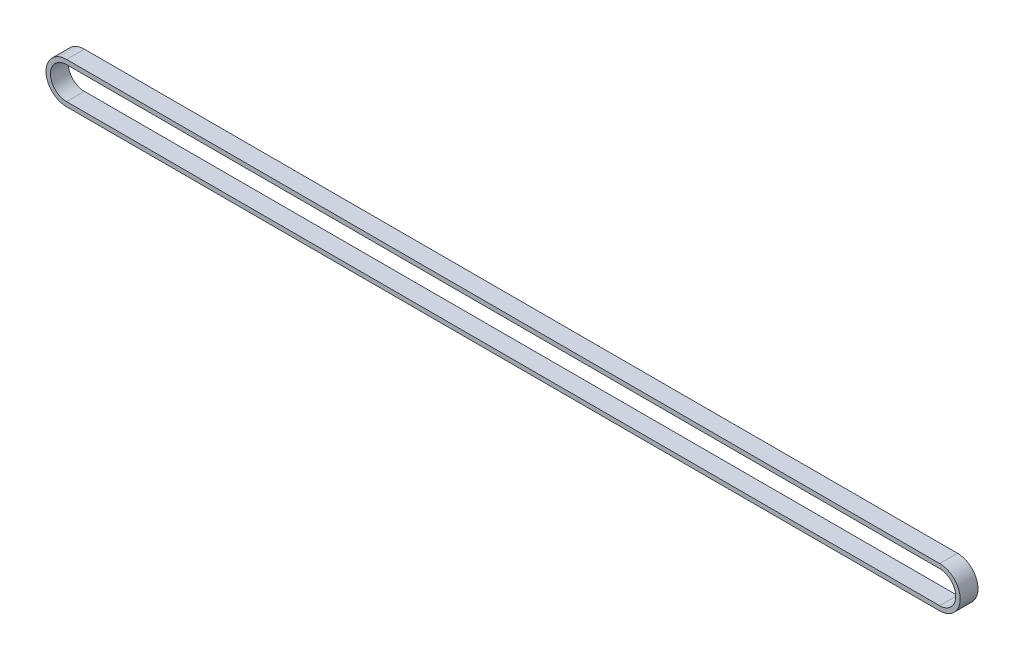
ISO-10303-21;
HEADER;
FILE_DESCRIPTION(('STEP AP214'),'2;1');
FILE_NAME('part.step','',(''),(''),'','','');
FILE_SCHEMA(('AUTOMOTIVE_DESIGN { 1 0 10303 214 1 1 1 1 }'));
ENDSEC;
DATA;
#1=APPLICATION_CONTEXT('core data for automotive mechanical design processes');
#2=APPLICATION_PROTOCOL_DEFINITION('international standard','automotive_design',2000,#1);
#3=PRODUCT_CONTEXT('',#1,'mechanical');
#4=PRODUCT('Part','Part','',(#3));
#5=PRODUCT_RELATED_PRODUCT_CATEGORY('part','',(#4));
#6=PRODUCT_DEFINITION_FORMATION('','',#4);
#7=PRODUCT_DEFINITION_CONTEXT('part definition',#1,'design');
#8=PRODUCT_DEFINITION('design','',#6,#7);
#9=PRODUCT_DEFINITION_SHAPE('','',#8);
#10=(LENGTH_UNIT() NAMED_UNIT(*) SI_UNIT(.MILLI.,.METRE.));
#11=(NAMED_UNIT(*) PLANE_ANGLE_UNIT() SI_UNIT($,.RADIAN.));
#12=(NAMED_UNIT(*) SI_UNIT($,.STERADIAN.) SOLID_ANGLE_UNIT());
#13=UNCERTAINTY_MEASURE_WITH_UNIT(LENGTH_MEASURE(1.E-05),#10,'distance_accuracy_value','');
#14=(GEOMETRIC_REPRESENTATION_CONTEXT(3) GLOBAL_UNCERTAINTY_ASSIGNED_CONTEXT((#13)) GLOBAL_UNIT_ASSIGNED_CONTEXT((#10,
#11,#12)) REPRESENTATION_CONTEXT('',''));
#15=CARTESIAN_POINT('',(0.,0.,0.));
#16=DIRECTION('',(0.,0.,1.));
#17=DIRECTION('',(1.,0.,0.));
#18=AXIS2_PLACEMENT_3D('',#15,#16,#17);
#19=CARTESIAN_POINT('',(-147.,0.,154.));
#20=DIRECTION('',(0.,0.,1.));
#21=DIRECTION('',(1.,0.,0.));
#22=AXIS2_PLACEMENT_3D('',#19,#20,#21);
#23=PLANE('',#22);
#24=CARTESIAN_POINT('',(-147.,0.,154.));
#25=DIRECTION('',(0.,0.,1.));
#26=DIRECTION('',(1.,0.,0.));
#27=AXIS2_PLACEMENT_3D('',#24,#25,#26);
#28=CIRCLE('',#27,6.9);
#29=CARTESIAN_POINT('',(-147.,6.9,154.));
#30=VERTEX_POINT('',#29);
#31=CARTESIAN_POINT('',(-147.,-6.9,154.));
#32=VERTEX_POINT('',#31);
#33=EDGE_CURVE('E118',#30,#32,#28,.T.);
#34=ORIENTED_EDGE('',*,*,#33,.T.);
#35=DIRECTION('',(1.,0.,0.));
#36=VECTOR('',#35,1.);
#37=CARTESIAN_POINT('',(-147.,-6.9,154.));
#38=LINE('',#37,#36);
#39=CARTESIAN_POINT('',(147.,-6.9,154.));
#40=VERTEX_POINT('',#39);
#41=EDGE_CURVE('E121',#32,#40,#38,.T.);
#42=ORIENTED_EDGE('',*,*,#41,.T.);
#43=CARTESIAN_POINT('',(147.,0.,154.));
#44=DIRECTION('',(0.,0.,1.));
#45=DIRECTION('',(1.,0.,0.));
#46=AXIS2_PLACEMENT_3D('',#43,#44,#45);
#47=CIRCLE('',#46,6.9);
#48=CARTESIAN_POINT('',(147.,6.9,154.));
#49=VERTEX_POINT('',#48);
#50=EDGE_CURVE('E124',#40,#49,#47,.T.);
#51=ORIENTED_EDGE('',*,*,#50,.T.);
#52=DIRECTION('',(-1.,0.,0.));
#53=VECTOR('',#52,1.);
#54=CARTESIAN_POINT('',(-147.,6.9,154.));
#55=LINE('',#54,#53);
#56=EDGE_CURVE('E126',#49,#30,#55,.T.);
#57=ORIENTED_EDGE('',*,*,#56,.T.);
#58=EDGE_LOOP('',(#34,#42,#51,#57));
#59=FACE_BOUND('',#58,.T.);
#60=DIRECTION('',(1.,0.,0.));
#61=VECTOR('',#60,1.);
#62=CARTESIAN_POINT('',(-147.,-5.4,154.));
#63=LINE('',#62,#61);
#64=CARTESIAN_POINT('',(-147.,-5.4,154.));
#65=VERTEX_POINT('',#64);
#66=CARTESIAN_POINT('',(147.,-5.4,154.));
#67=VERTEX_POINT('',#66);
#68=EDGE_CURVE('E90',#65,#67,#63,.T.);
#69=ORIENTED_EDGE('',*,*,#68,.F.);
#70=CARTESIAN_POINT('',(-147.,0.,154.));
#71=DIRECTION('',(0.,0.,1.));
#72=DIRECTION('',(1.,0.,0.));
#73=AXIS2_PLACEMENT_3D('',#70,#71,#72);
#74=CIRCLE('',#73,5.4);
#75=CARTESIAN_POINT('',(-147.,5.4,154.));
#76=VERTEX_POINT('',#75);
#77=EDGE_CURVE('E82',#76,#65,#74,.T.);
#78=ORIENTED_EDGE('',*,*,#77,.F.);
#79=DIRECTION('',(-1.,0.,0.));
#80=VECTOR('',#79,1.);
#81=CARTESIAN_POINT('',(-147.,5.4,154.));
#82=LINE('',#81,#80);
#83=CARTESIAN_POINT('',(147.,5.4,154.));
#84=VERTEX_POINT('',#83);
#85=EDGE_CURVE('E104',#84,#76,#82,.T.);
#86=ORIENTED_EDGE('',*,*,#85,.F.);
#87=CARTESIAN_POINT('',(147.,0.,154.));
#88=DIRECTION('',(0.,0.,1.));
#89=DIRECTION('',(1.,0.,0.));
#90=AXIS2_PLACEMENT_3D('',#87,#88,#89);
#91=CIRCLE('',#90,5.4);
#92=EDGE_CURVE('E102',#67,#84,#91,.T.);
#93=ORIENTED_EDGE('',*,*,#92,.F.);
#94=EDGE_LOOP('',(#69,#78,#86,#93));
#95=FACE_BOUND('',#94,.T.);
#96=ADVANCED_FACE('F17',(#59,#95),#23,.T.);
#97=CARTESIAN_POINT('',(-147.,0.,148.));
#98=DIRECTION('',(0.,0.,1.));
#99=DIRECTION('',(1.,0.,0.));
#100=AXIS2_PLACEMENT_3D('',#97,#98,#99);
#101=PLANE('',#100);
#102=CARTESIAN_POINT('',(-147.,0.,148.));
#103=DIRECTION('',(0.,0.,1.));
#104=DIRECTION('',(1.,0.,0.));
#105=AXIS2_PLACEMENT_3D('',#102,#103,#104);
#106=CIRCLE('',#105,6.9);
#107=CARTESIAN_POINT('',(-147.,6.9,148.));
#108=VERTEX_POINT('',#107);
#109=CARTESIAN_POINT('',(-147.,-6.9,148.));
#110=VERTEX_POINT('',#109);
#111=EDGE_CURVE('E98',#108,#110,#106,.T.);
#112=ORIENTED_EDGE('',*,*,#111,.F.);
#113=DIRECTION('',(-1.,0.,0.));
#114=VECTOR('',#113,1.);
#115=CARTESIAN_POINT('',(-147.,6.9,148.));
#116=LINE('',#115,#114);
#117=CARTESIAN_POINT('',(147.,6.9,148.));
#118=VERTEX_POINT('',#117);
#119=EDGE_CURVE('E122',#118,#108,#116,.T.);
#120=ORIENTED_EDGE('',*,*,#119,.F.);
#121=CARTESIAN_POINT('',(147.,0.,148.));
#122=DIRECTION('',(0.,0.,1.));
#123=DIRECTION('',(1.,0.,0.));
#124=AXIS2_PLACEMENT_3D('',#121,#122,#123);
#125=CIRCLE('',#124,6.9);
#126=CARTESIAN_POINT('',(147.,-6.9,148.));
#127=VERTEX_POINT('',#126);
#128=EDGE_CURVE('E133',#127,#118,#125,.T.);
#129=ORIENTED_EDGE('',*,*,#128,.F.);
#130=DIRECTION('',(1.,0.,0.));
#131=VECTOR('',#130,1.);
#132=CARTESIAN_POINT('',(-147.,-6.9,148.));
#133=LINE('',#132,#131);
#134=EDGE_CURVE('E131',#110,#127,#133,.T.);
#135=ORIENTED_EDGE('',*,*,#134,.F.);
#136=EDGE_LOOP('',(#112,#120,#129,#135));
#137=FACE_BOUND('',#136,.T.);
#138=CARTESIAN_POINT('',(-147.,0.,148.));
#139=DIRECTION('',(0.,0.,1.));
#140=DIRECTION('',(1.,0.,0.));
#141=AXIS2_PLACEMENT_3D('',#138,#139,#140);
#142=CIRCLE('',#141,5.4);
#143=CARTESIAN_POINT('',(-147.,5.4,148.));
#144=VERTEX_POINT('',#143);
#145=CARTESIAN_POINT('',(-147.,-5.4,148.));
#146=VERTEX_POINT('',#145);
#147=EDGE_CURVE('E40',#144,#146,#142,.T.);
#148=ORIENTED_EDGE('',*,*,#147,.T.);
#149=DIRECTION('',(1.,0.,0.));
#150=VECTOR('',#149,1.);
#151=CARTESIAN_POINT('',(-147.,-5.4,148.));
#152=LINE('',#151,#150);
#153=CARTESIAN_POINT('',(147.,-5.4,148.));
#154=VERTEX_POINT('',#153);
#155=EDGE_CURVE('E97',#146,#154,#152,.T.);
#156=ORIENTED_EDGE('',*,*,#155,.T.);
#157=CARTESIAN_POINT('',(147.,0.,148.));
#158=DIRECTION('',(0.,0.,1.));
#159=DIRECTION('',(1.,0.,0.));
#160=AXIS2_PLACEMENT_3D('',#157,#158,#159);
#161=CIRCLE('',#160,5.4);
#162=CARTESIAN_POINT('',(147.,5.4,148.));
#163=VERTEX_POINT('',#162);
#164=EDGE_CURVE('E110',#154,#163,#161,.T.);
#165=ORIENTED_EDGE('',*,*,#164,.T.);
#166=DIRECTION('',(-1.,0.,0.));
#167=VECTOR('',#166,1.);
#168=CARTESIAN_POINT('',(-147.,5.4,148.));
#169=LINE('',#168,#167);
#170=EDGE_CURVE('E91',#163,#144,#169,.T.);
#171=ORIENTED_EDGE('',*,*,#170,.T.);
#172=EDGE_LOOP('',(#148,#156,#165,#171));
#173=FACE_BOUND('',#172,.T.);
#174=ADVANCED_FACE('F151',(#137,#173),#101,.F.);
#175=CARTESIAN_POINT('',(-147.,0.,154.));
#176=DIRECTION('',(0.,0.,-1.));
#177=DIRECTION('',(-1.,0.,0.));
#178=AXIS2_PLACEMENT_3D('',#175,#176,#177);
#179=CYLINDRICAL_SURFACE('',#178,6.9);
#180=ORIENTED_EDGE('',*,*,#111,.T.);
#181=DIRECTION('',(0.,0.,-1.));
#182=VECTOR('',#181,1.);
#183=CARTESIAN_POINT('',(-147.,-6.9,154.));
#184=LINE('',#183,#182);
#185=EDGE_CURVE('E11',#32,#110,#184,.T.);
#186=ORIENTED_EDGE('',*,*,#185,.F.);
#187=ORIENTED_EDGE('',*,*,#33,.F.);
#188=DIRECTION('',(0.,0.,-1.));
#189=VECTOR('',#188,1.);
#190=CARTESIAN_POINT('',(-147.,6.9,154.));
#191=LINE('',#190,#189);
#192=EDGE_CURVE('E128',#30,#108,#191,.T.);
#193=ORIENTED_EDGE('',*,*,#192,.T.);
#194=EDGE_LOOP('',(#180,#186,#187,#193));
#195=FACE_BOUND('',#194,.T.);
#196=ADVANCED_FACE('F19',(#195),#179,.T.);
#197=CARTESIAN_POINT('',(-147.,-6.9,154.));
#198=DIRECTION('',(0.,1.,0.));
#199=DIRECTION('',(-1.,0.,0.));
#200=AXIS2_PLACEMENT_3D('',#197,#198,#199);
#201=PLANE('',#200);
#202=ORIENTED_EDGE('',*,*,#134,.T.);
#203=DIRECTION('',(0.,0.,-1.));
#204=VECTOR('',#203,1.);
#205=CARTESIAN_POINT('',(147.,-6.9,154.));
#206=LINE('',#205,#204);
#207=EDGE_CURVE('E25',#40,#127,#206,.T.);
#208=ORIENTED_EDGE('',*,*,#207,.F.);
#209=ORIENTED_EDGE('',*,*,#41,.F.);
#210=ORIENTED_EDGE('',*,*,#185,.T.);
#211=EDGE_LOOP('',(#202,#208,#209,#210));
#212=FACE_BOUND('',#211,.T.);
#213=ADVANCED_FACE('F161',(#212),#201,.F.);
#214=CARTESIAN_POINT('',(147.,0.,154.));
#215=DIRECTION('',(0.,0.,-1.));
#216=DIRECTION('',(-1.,0.,0.));
#217=AXIS2_PLACEMENT_3D('',#214,#215,#216);
#218=CYLINDRICAL_SURFACE('',#217,6.9);
#219=ORIENTED_EDGE('',*,*,#128,.T.);
#220=DIRECTION('',(0.,0.,-1.));
#221=VECTOR('',#220,1.);
#222=CARTESIAN_POINT('',(147.,6.9,154.));
#223=LINE('',#222,#221);
#224=EDGE_CURVE('E138',#49,#118,#223,.T.);
#225=ORIENTED_EDGE('',*,*,#224,.F.);
#226=ORIENTED_EDGE('',*,*,#50,.F.);
#227=ORIENTED_EDGE('',*,*,#207,.T.);
#228=EDGE_LOOP('',(#219,#225,#226,#227));
#229=FACE_BOUND('',#228,.T.);
#230=ADVANCED_FACE('F145',(#229),#218,.T.);
#231=CARTESIAN_POINT('',(-147.,6.9,154.));
#232=DIRECTION('',(0.,-1.,0.));
#233=DIRECTION('',(0.,0.,-1.));
#234=AXIS2_PLACEMENT_3D('',#231,#232,#233);
#235=PLANE('',#234);
#236=ORIENTED_EDGE('',*,*,#119,.T.);
#237=ORIENTED_EDGE('',*,*,#192,.F.);
#238=ORIENTED_EDGE('',*,*,#56,.F.);
#239=ORIENTED_EDGE('',*,*,#224,.T.);
#240=EDGE_LOOP('',(#236,#237,#238,#239));
#241=FACE_BOUND('',#240,.T.);
#242=ADVANCED_FACE('F155',(#241),#235,.F.);
#243=CARTESIAN_POINT('',(-147.,0.,154.));
#244=DIRECTION('',(0.,0.,-1.));
#245=DIRECTION('',(-1.,0.,0.));
#246=AXIS2_PLACEMENT_3D('',#243,#244,#245);
#247=CYLINDRICAL_SURFACE('',#246,5.4);
#248=ORIENTED_EDGE('',*,*,#147,.F.);
#249=DIRECTION('',(0.,0.,-1.));
#250=VECTOR('',#249,1.);
#251=CARTESIAN_POINT('',(-147.,5.4,154.));
#252=LINE('',#251,#250);
#253=EDGE_CURVE('E86',#76,#144,#252,.T.);
#254=ORIENTED_EDGE('',*,*,#253,.F.);
#255=ORIENTED_EDGE('',*,*,#77,.T.);
#256=DIRECTION('',(0.,0.,-1.));
#257=VECTOR('',#256,1.);
#258=CARTESIAN_POINT('',(-147.,-5.4,154.));
#259=LINE('',#258,#257);
#260=EDGE_CURVE('E85',#65,#146,#259,.T.);
#261=ORIENTED_EDGE('',*,*,#260,.T.);
#262=EDGE_LOOP('',(#248,#254,#255,#261));
#263=FACE_BOUND('',#262,.T.);
#264=ADVANCED_FACE('F84',(#263),#247,.F.);
#265=CARTESIAN_POINT('',(-147.,-5.4,154.));
#266=DIRECTION('',(0.,1.,0.));
#267=DIRECTION('',(0.,0.,1.));
#268=AXIS2_PLACEMENT_3D('',#265,#266,#267);
#269=PLANE('',#268);
#270=ORIENTED_EDGE('',*,*,#155,.F.);
#271=ORIENTED_EDGE('',*,*,#260,.F.);
#272=ORIENTED_EDGE('',*,*,#68,.T.);
#273=DIRECTION('',(0.,0.,-1.));
#274=VECTOR('',#273,1.);
#275=CARTESIAN_POINT('',(147.,-5.4,154.));
#276=LINE('',#275,#274);
#277=EDGE_CURVE('E99',#67,#154,#276,.T.);
#278=ORIENTED_EDGE('',*,*,#277,.T.);
#279=EDGE_LOOP('',(#270,#271,#272,#278));
#280=FACE_BOUND('',#279,.T.);
#281=ADVANCED_FACE('F94',(#280),#269,.T.);
#282=CARTESIAN_POINT('',(147.,0.,154.));
#283=DIRECTION('',(0.,0.,-1.));
#284=DIRECTION('',(-1.,0.,0.));
#285=AXIS2_PLACEMENT_3D('',#282,#283,#284);
#286=CYLINDRICAL_SURFACE('',#285,5.4);
#287=ORIENTED_EDGE('',*,*,#164,.F.);
#288=ORIENTED_EDGE('',*,*,#277,.F.);
#289=ORIENTED_EDGE('',*,*,#92,.T.);
#290=DIRECTION('',(0.,0.,-1.));
#291=VECTOR('',#290,1.);
#292=CARTESIAN_POINT('',(147.,5.4,154.));
#293=LINE('',#292,#291);
#294=EDGE_CURVE('E32',#84,#163,#293,.T.);
#295=ORIENTED_EDGE('',*,*,#294,.T.);
#296=EDGE_LOOP('',(#287,#288,#289,#295));
#297=FACE_BOUND('',#296,.T.);
#298=ADVANCED_FACE('F189',(#297),#286,.F.);
#299=CARTESIAN_POINT('',(-147.,5.4,154.));
#300=DIRECTION('',(0.,-1.,0.));
#301=DIRECTION('',(0.,0.,-1.));
#302=AXIS2_PLACEMENT_3D('',#299,#300,#301);
#303=PLANE('',#302);
#304=ORIENTED_EDGE('',*,*,#170,.F.);
#305=ORIENTED_EDGE('',*,*,#294,.F.);
#306=ORIENTED_EDGE('',*,*,#85,.T.);
#307=ORIENTED_EDGE('',*,*,#253,.T.);
#308=EDGE_LOOP('',(#304,#305,#306,#307));
#309=FACE_BOUND('',#308,.T.);
#310=ADVANCED_FACE('F194',(#309),#303,.T.);
#311=CLOSED_SHELL('',(#96,#174,#196,#213,#230,#242,#264,#281,#298,#310));
#312=MANIFOLD_SOLID_BREP('B1',#311);
#313=ADVANCED_BREP_SHAPE_REPRESENTATION('',(#18,#312),#14);
#314=SHAPE_DEFINITION_REPRESENTATION(#9,#313);
ENDSEC;
END-ISO-10303-21;
